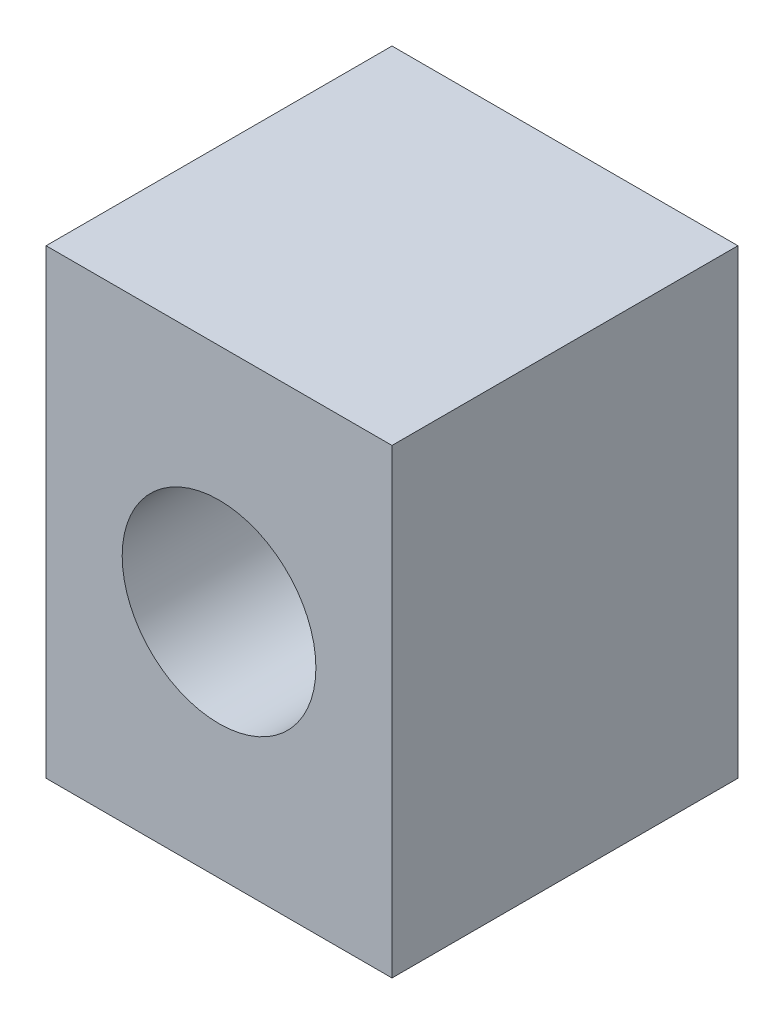
ISO-10303-21;
HEADER;
FILE_DESCRIPTION(('STEP AP214'),'2;1');
FILE_NAME('part.step','',(''),(''),'','','');
FILE_SCHEMA(('AUTOMOTIVE_DESIGN { 1 0 10303 214 1 1 1 1 }'));
ENDSEC;
DATA;
#1=APPLICATION_CONTEXT('core data for automotive mechanical design processes');
#2=APPLICATION_PROTOCOL_DEFINITION('international standard','automotive_design',2000,#1);
#3=PRODUCT_CONTEXT('',#1,'mechanical');
#4=PRODUCT('Part','Part','',(#3));
#5=PRODUCT_RELATED_PRODUCT_CATEGORY('part','',(#4));
#6=PRODUCT_DEFINITION_FORMATION('','',#4);
#7=PRODUCT_DEFINITION_CONTEXT('part definition',#1,'design');
#8=PRODUCT_DEFINITION('design','',#6,#7);
#9=PRODUCT_DEFINITION_SHAPE('','',#8);
#10=(LENGTH_UNIT() NAMED_UNIT(*) SI_UNIT(.MILLI.,.METRE.));
#11=(NAMED_UNIT(*) PLANE_ANGLE_UNIT() SI_UNIT($,.RADIAN.));
#12=(NAMED_UNIT(*) SI_UNIT($,.STERADIAN.) SOLID_ANGLE_UNIT());
#13=UNCERTAINTY_MEASURE_WITH_UNIT(LENGTH_MEASURE(1.E-05),#10,'distance_accuracy_value','');
#14=(GEOMETRIC_REPRESENTATION_CONTEXT(3) GLOBAL_UNCERTAINTY_ASSIGNED_CONTEXT((#13)) GLOBAL_UNIT_ASSIGNED_CONTEXT((#10,
#11,#12)) REPRESENTATION_CONTEXT('',''));
#15=CARTESIAN_POINT('',(0.,0.,0.));
#16=DIRECTION('',(0.,0.,1.));
#17=DIRECTION('',(1.,0.,0.));
#18=AXIS2_PLACEMENT_3D('',#15,#16,#17);
#19=CARTESIAN_POINT('',(0.,0.,38.1));
#20=DIRECTION('',(0.,0.,-1.));
#21=DIRECTION('',(-1.,0.,0.));
#22=AXIS2_PLACEMENT_3D('',#19,#20,#21);
#23=PLANE('',#22);
#24=DIRECTION('',(0.,1.,0.));
#25=VECTOR('',#24,1.);
#26=CARTESIAN_POINT('',(19.05,-25.4,38.1));
#27=LINE('',#26,#25);
#28=CARTESIAN_POINT('',(19.05,-25.4,38.1));
#29=VERTEX_POINT('',#28);
#30=CARTESIAN_POINT('',(19.05,25.4,38.1));
#31=VERTEX_POINT('',#30);
#32=EDGE_CURVE('E85',#29,#31,#27,.T.);
#33=ORIENTED_EDGE('',*,*,#32,.T.);
#34=DIRECTION('',(-1.,0.,0.));
#35=VECTOR('',#34,1.);
#36=CARTESIAN_POINT('',(-19.05,25.4,38.1));
#37=LINE('',#36,#35);
#38=CARTESIAN_POINT('',(-19.05,25.4,38.1));
#39=VERTEX_POINT('',#38);
#40=EDGE_CURVE('E80',#31,#39,#37,.T.);
#41=ORIENTED_EDGE('',*,*,#40,.T.);
#42=DIRECTION('',(0.,-1.,0.));
#43=VECTOR('',#42,1.);
#44=CARTESIAN_POINT('',(-19.05,-25.4,38.1));
#45=LINE('',#44,#43);
#46=CARTESIAN_POINT('',(-19.05,-25.4,38.1));
#47=VERTEX_POINT('',#46);
#48=EDGE_CURVE('E83',#39,#47,#45,.T.);
#49=ORIENTED_EDGE('',*,*,#48,.T.);
#50=DIRECTION('',(1.,0.,0.));
#51=VECTOR('',#50,1.);
#52=CARTESIAN_POINT('',(-19.05,-25.4,38.1));
#53=LINE('',#52,#51);
#54=EDGE_CURVE('E50',#47,#29,#53,.T.);
#55=ORIENTED_EDGE('',*,*,#54,.T.);
#56=EDGE_LOOP('',(#33,#41,#49,#55));
#57=FACE_BOUND('',#56,.T.);
#58=CARTESIAN_POINT('',(0.,0.,38.1));
#59=DIRECTION('',(0.,0.,1.));
#60=DIRECTION('',(1.,0.,0.));
#61=AXIS2_PLACEMENT_3D('',#58,#59,#60);
#62=CIRCLE('',#61,10.668);
#63=CARTESIAN_POINT('',(-10.668,0.,38.1));
#64=VERTEX_POINT('',#63);
#65=EDGE_CURVE('E100',#64,#64,#62,.T.);
#66=ORIENTED_EDGE('',*,*,#65,.F.);
#67=EDGE_LOOP('',(#66));
#68=FACE_BOUND('',#67,.T.);
#69=ADVANCED_FACE('F33',(#57,#68),#23,.F.);
#70=CARTESIAN_POINT('',(0.,0.,0.));
#71=DIRECTION('',(0.,0.,-1.));
#72=DIRECTION('',(-1.,0.,0.));
#73=AXIS2_PLACEMENT_3D('',#70,#71,#72);
#74=PLANE('',#73);
#75=DIRECTION('',(0.,1.,0.));
#76=VECTOR('',#75,1.);
#77=CARTESIAN_POINT('',(19.05,-25.4,0.));
#78=LINE('',#77,#76);
#79=CARTESIAN_POINT('',(19.05,-25.4,0.));
#80=VERTEX_POINT('',#79);
#81=CARTESIAN_POINT('',(19.05,25.4,0.));
#82=VERTEX_POINT('',#81);
#83=EDGE_CURVE('E97',#80,#82,#78,.T.);
#84=ORIENTED_EDGE('',*,*,#83,.F.);
#85=DIRECTION('',(1.,0.,0.));
#86=VECTOR('',#85,1.);
#87=CARTESIAN_POINT('',(-19.05,-25.4,0.));
#88=LINE('',#87,#86);
#89=CARTESIAN_POINT('',(-19.05,-25.4,0.));
#90=VERTEX_POINT('',#89);
#91=EDGE_CURVE('E73',#90,#80,#88,.T.);
#92=ORIENTED_EDGE('',*,*,#91,.F.);
#93=DIRECTION('',(0.,-1.,0.));
#94=VECTOR('',#93,1.);
#95=CARTESIAN_POINT('',(-19.05,-25.4,0.));
#96=LINE('',#95,#94);
#97=CARTESIAN_POINT('',(-19.05,25.4,0.));
#98=VERTEX_POINT('',#97);
#99=EDGE_CURVE('E67',#98,#90,#96,.T.);
#100=ORIENTED_EDGE('',*,*,#99,.F.);
#101=DIRECTION('',(-1.,0.,0.));
#102=VECTOR('',#101,1.);
#103=CARTESIAN_POINT('',(-19.05,25.4,0.));
#104=LINE('',#103,#102);
#105=EDGE_CURVE('E89',#82,#98,#104,.T.);
#106=ORIENTED_EDGE('',*,*,#105,.F.);
#107=EDGE_LOOP('',(#84,#92,#100,#106));
#108=FACE_BOUND('',#107,.T.);
#109=CARTESIAN_POINT('',(0.,0.,0.));
#110=DIRECTION('',(0.,0.,1.));
#111=DIRECTION('',(1.,0.,0.));
#112=AXIS2_PLACEMENT_3D('',#109,#110,#111);
#113=CIRCLE('',#112,10.668);
#114=CARTESIAN_POINT('',(-10.668,0.,0.));
#115=VERTEX_POINT('',#114);
#116=EDGE_CURVE('E112',#115,#115,#113,.T.);
#117=ORIENTED_EDGE('',*,*,#116,.T.);
#118=EDGE_LOOP('',(#117));
#119=FACE_BOUND('',#118,.T.);
#120=ADVANCED_FACE('F108',(#108,#119),#74,.T.);
#121=CARTESIAN_POINT('',(19.05,-25.4,38.1));
#122=DIRECTION('',(-1.,0.,0.));
#123=DIRECTION('',(0.,0.,1.));
#124=AXIS2_PLACEMENT_3D('',#121,#122,#123);
#125=PLANE('',#124);
#126=ORIENTED_EDGE('',*,*,#83,.T.);
#127=DIRECTION('',(0.,0.,-1.));
#128=VECTOR('',#127,1.);
#129=CARTESIAN_POINT('',(19.05,25.4,38.1));
#130=LINE('',#129,#128);
#131=EDGE_CURVE('E11',#31,#82,#130,.T.);
#132=ORIENTED_EDGE('',*,*,#131,.F.);
#133=ORIENTED_EDGE('',*,*,#32,.F.);
#134=DIRECTION('',(0.,0.,-1.));
#135=VECTOR('',#134,1.);
#136=CARTESIAN_POINT('',(19.05,-25.4,38.1));
#137=LINE('',#136,#135);
#138=EDGE_CURVE('E93',#29,#80,#137,.T.);
#139=ORIENTED_EDGE('',*,*,#138,.T.);
#140=EDGE_LOOP('',(#126,#132,#133,#139));
#141=FACE_BOUND('',#140,.T.);
#142=ADVANCED_FACE('F35',(#141),#125,.F.);
#143=CARTESIAN_POINT('',(-19.05,25.4,38.1));
#144=DIRECTION('',(0.,-1.,0.));
#145=DIRECTION('',(0.,0.,-1.));
#146=AXIS2_PLACEMENT_3D('',#143,#144,#145);
#147=PLANE('',#146);
#148=ORIENTED_EDGE('',*,*,#105,.T.);
#149=DIRECTION('',(0.,0.,-1.));
#150=VECTOR('',#149,1.);
#151=CARTESIAN_POINT('',(-19.05,25.4,38.1));
#152=LINE('',#151,#150);
#153=EDGE_CURVE('E42',#39,#98,#152,.T.);
#154=ORIENTED_EDGE('',*,*,#153,.F.);
#155=ORIENTED_EDGE('',*,*,#40,.F.);
#156=ORIENTED_EDGE('',*,*,#131,.T.);
#157=EDGE_LOOP('',(#148,#154,#155,#156));
#158=FACE_BOUND('',#157,.T.);
#159=ADVANCED_FACE('F88',(#158),#147,.F.);
#160=CARTESIAN_POINT('',(-19.05,-25.4,38.1));
#161=DIRECTION('',(1.,0.,0.));
#162=DIRECTION('',(0.,0.,-1.));
#163=AXIS2_PLACEMENT_3D('',#160,#161,#162);
#164=PLANE('',#163);
#165=ORIENTED_EDGE('',*,*,#99,.T.);
#166=DIRECTION('',(0.,0.,-1.));
#167=VECTOR('',#166,1.);
#168=CARTESIAN_POINT('',(-19.05,-25.4,38.1));
#169=LINE('',#168,#167);
#170=EDGE_CURVE('E90',#47,#90,#169,.T.);
#171=ORIENTED_EDGE('',*,*,#170,.F.);
#172=ORIENTED_EDGE('',*,*,#48,.F.);
#173=ORIENTED_EDGE('',*,*,#153,.T.);
#174=EDGE_LOOP('',(#165,#171,#172,#173));
#175=FACE_BOUND('',#174,.T.);
#176=ADVANCED_FACE('F91',(#175),#164,.F.);
#177=CARTESIAN_POINT('',(-19.05,-25.4,38.1));
#178=DIRECTION('',(0.,1.,0.));
#179=DIRECTION('',(0.,0.,1.));
#180=AXIS2_PLACEMENT_3D('',#177,#178,#179);
#181=PLANE('',#180);
#182=ORIENTED_EDGE('',*,*,#91,.T.);
#183=ORIENTED_EDGE('',*,*,#138,.F.);
#184=ORIENTED_EDGE('',*,*,#54,.F.);
#185=ORIENTED_EDGE('',*,*,#170,.T.);
#186=EDGE_LOOP('',(#182,#183,#184,#185));
#187=FACE_BOUND('',#186,.T.);
#188=ADVANCED_FACE('F105',(#187),#181,.F.);
#189=CARTESIAN_POINT('',(0.,0.,38.1));
#190=DIRECTION('',(0.,0.,-1.));
#191=DIRECTION('',(-1.,0.,0.));
#192=AXIS2_PLACEMENT_3D('',#189,#190,#191);
#193=CYLINDRICAL_SURFACE('',#192,10.668);
#194=CARTESIAN_POINT('',(-10.668,0.,38.1));
#195=CARTESIAN_POINT('',(-10.668,0.,37.703125));
#196=CARTESIAN_POINT('',(-10.668,0.,37.30625));
#197=CARTESIAN_POINT('',(-10.668,0.,36.5125));
#198=CARTESIAN_POINT('',(-10.668,0.,36.115625));
#199=CARTESIAN_POINT('',(-10.668,0.,35.321875));
#200=CARTESIAN_POINT('',(-10.668,0.,34.925));
#201=CARTESIAN_POINT('',(-10.668,0.,34.13125));
#202=CARTESIAN_POINT('',(-10.668,0.,33.734375));
#203=CARTESIAN_POINT('',(-10.668,0.,32.940625));
#204=CARTESIAN_POINT('',(-10.668,0.,32.54375));
#205=CARTESIAN_POINT('',(-10.668,0.,31.75));
#206=CARTESIAN_POINT('',(-10.668,0.,31.353125));
#207=CARTESIAN_POINT('',(-10.668,0.,30.559375));
#208=CARTESIAN_POINT('',(-10.668,0.,30.1625));
#209=CARTESIAN_POINT('',(-10.668,0.,29.36875));
#210=CARTESIAN_POINT('',(-10.668,0.,28.971875));
#211=CARTESIAN_POINT('',(-10.668,0.,28.178125));
#212=CARTESIAN_POINT('',(-10.668,0.,27.78125));
#213=CARTESIAN_POINT('',(-10.668,0.,26.9875));
#214=CARTESIAN_POINT('',(-10.668,0.,26.590625));
#215=CARTESIAN_POINT('',(-10.668,0.,25.796875));
#216=CARTESIAN_POINT('',(-10.668,0.,25.4));
#217=CARTESIAN_POINT('',(-10.668,0.,24.60625));
#218=CARTESIAN_POINT('',(-10.668,0.,24.209375));
#219=CARTESIAN_POINT('',(-10.668,0.,23.415625));
#220=CARTESIAN_POINT('',(-10.668,0.,23.01875));
#221=CARTESIAN_POINT('',(-10.668,0.,22.225));
#222=CARTESIAN_POINT('',(-10.668,0.,21.828125));
#223=CARTESIAN_POINT('',(-10.668,0.,21.034375));
#224=CARTESIAN_POINT('',(-10.668,0.,20.6375));
#225=CARTESIAN_POINT('',(-10.668,0.,19.84375));
#226=CARTESIAN_POINT('',(-10.668,0.,19.446875));
#227=CARTESIAN_POINT('',(-10.668,0.,18.653125));
#228=CARTESIAN_POINT('',(-10.668,0.,18.25625));
#229=CARTESIAN_POINT('',(-10.668,0.,17.4625));
#230=CARTESIAN_POINT('',(-10.668,0.,17.065625));
#231=CARTESIAN_POINT('',(-10.668,0.,16.271875));
#232=CARTESIAN_POINT('',(-10.668,0.,15.875));
#233=CARTESIAN_POINT('',(-10.668,0.,15.08125));
#234=CARTESIAN_POINT('',(-10.668,0.,14.684375));
#235=CARTESIAN_POINT('',(-10.668,0.,13.890625));
#236=CARTESIAN_POINT('',(-10.668,0.,13.49375));
#237=CARTESIAN_POINT('',(-10.668,0.,12.7));
#238=CARTESIAN_POINT('',(-10.668,0.,12.303125));
#239=CARTESIAN_POINT('',(-10.668,0.,11.509375));
#240=CARTESIAN_POINT('',(-10.668,0.,11.1125));
#241=CARTESIAN_POINT('',(-10.668,0.,10.31875));
#242=CARTESIAN_POINT('',(-10.668,0.,9.92187499999999));
#243=CARTESIAN_POINT('',(-10.668,0.,9.128125));
#244=CARTESIAN_POINT('',(-10.668,0.,8.73124999999999));
#245=CARTESIAN_POINT('',(-10.668,0.,7.93749999999999));
#246=CARTESIAN_POINT('',(-10.668,0.,7.54062499999999));
#247=CARTESIAN_POINT('',(-10.668,0.,6.746875));
#248=CARTESIAN_POINT('',(-10.668,0.,6.35));
#249=CARTESIAN_POINT('',(-10.668,0.,5.55625));
#250=CARTESIAN_POINT('',(-10.668,0.,5.159375));
#251=CARTESIAN_POINT('',(-10.668,0.,4.365625));
#252=CARTESIAN_POINT('',(-10.668,0.,3.96875));
#253=CARTESIAN_POINT('',(-10.668,0.,3.175));
#254=CARTESIAN_POINT('',(-10.668,0.,2.778125));
#255=CARTESIAN_POINT('',(-10.668,0.,1.984375));
#256=CARTESIAN_POINT('',(-10.668,0.,1.5875));
#257=CARTESIAN_POINT('',(-10.668,0.,0.79375));
#258=CARTESIAN_POINT('',(-10.668,0.,0.396875));
#259=CARTESIAN_POINT('',(-10.668,0.,0.));
#260=B_SPLINE_CURVE_WITH_KNOTS('',3,(#194,#195,#196,#197,#198,#199,#200,#201,#202,#203,#204,
#205,#206,#207,#208,#209,#210,#211,#212,#213,#214,#215,#216,#217,#218,#219,#220,#221,#222,#223,
#224,#225,#226,#227,#228,#229,#230,#231,#232,#233,#234,#235,#236,#237,#238,#239,#240,#241,#242,
#243,#244,#245,#246,#247,#248,#249,#250,#251,#252,#253,#254,#255,#256,#257,#258,#259),
.UNSPECIFIED.,.F.,.F.,(4,2,2,2,2,2,2,2,2,2,2,2,2,2,2,2,2,2,2,2,2,2,2,2,2,2,2,2,2,2,2,2,4),(0.,
1.190625,2.38125,3.571875,4.7625,5.953125,7.14375,8.334375,9.52500000000001,10.715625,11.90625,
13.096875,14.2875,15.478125,16.66875,17.859375,19.05,20.240625,21.43125,22.621875,23.8125,
25.003125,26.19375,27.384375,28.575,29.765625,30.95625,32.146875,33.3375,34.528125,35.71875,
36.909375,38.1),.UNSPECIFIED.);
#261=EDGE_CURVE('BSEAM118',#64,#115,#260,.T.);
#262=ORIENTED_EDGE('',*,*,#65,.T.);
#263=ORIENTED_EDGE('',*,*,#116,.F.);
#264=ORIENTED_EDGE('',*,*,#261,.T.);
#265=ORIENTED_EDGE('',*,*,#261,.F.);
#266=EDGE_LOOP('',(#262,#264,#263,#265));
#267=FACE_BOUND('',#266,.T.);
#268=ADVANCED_FACE('F118',(#267),#193,.F.);
#269=CLOSED_SHELL('',(#69,#120,#142,#159,#176,#188,#268));
#270=MANIFOLD_SOLID_BREP('B2',#269);
#271=ADVANCED_BREP_SHAPE_REPRESENTATION('',(#18,#270),#14);
#272=SHAPE_DEFINITION_REPRESENTATION(#9,#271);
ENDSEC;
END-ISO-10303-21;
